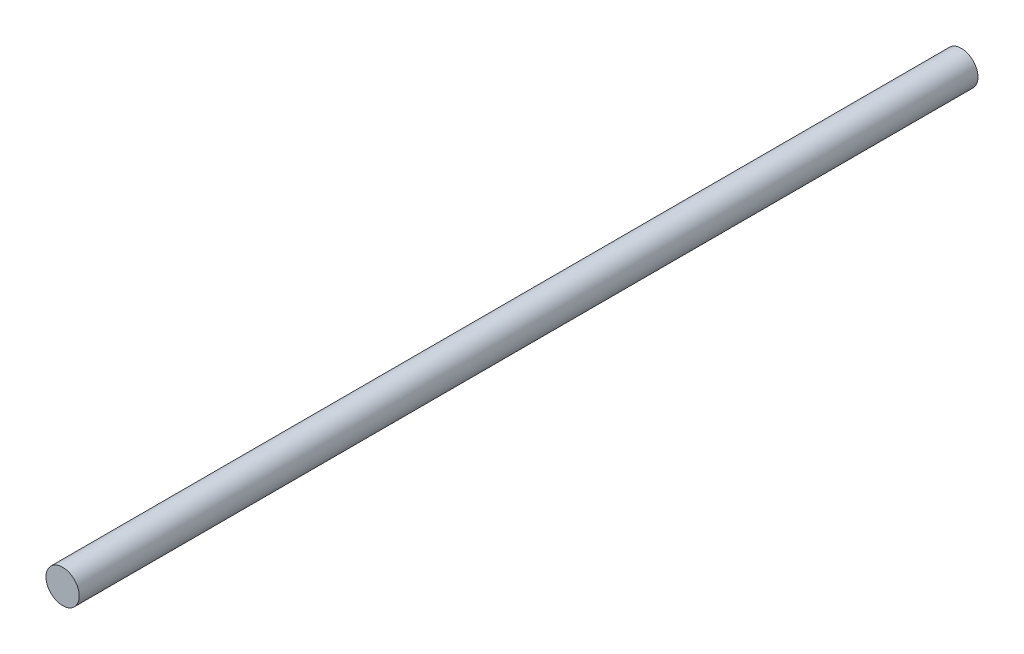
ISO-10303-21;
HEADER;
FILE_DESCRIPTION(('STEP AP214'),'2;1');
FILE_NAME('part.step','',(''),(''),'','','');
FILE_SCHEMA(('AUTOMOTIVE_DESIGN { 1 0 10303 214 1 1 1 1 }'));
ENDSEC;
DATA;
#1=APPLICATION_CONTEXT('core data for automotive mechanical design processes');
#2=APPLICATION_PROTOCOL_DEFINITION('international standard','automotive_design',2000,#1);
#3=PRODUCT_CONTEXT('',#1,'mechanical');
#4=PRODUCT('Part','Part','',(#3));
#5=PRODUCT_RELATED_PRODUCT_CATEGORY('part','',(#4));
#6=PRODUCT_DEFINITION_FORMATION('','',#4);
#7=PRODUCT_DEFINITION_CONTEXT('part definition',#1,'design');
#8=PRODUCT_DEFINITION('design','',#6,#7);
#9=PRODUCT_DEFINITION_SHAPE('','',#8);
#10=(LENGTH_UNIT() NAMED_UNIT(*) SI_UNIT(.MILLI.,.METRE.));
#11=(NAMED_UNIT(*) PLANE_ANGLE_UNIT() SI_UNIT($,.RADIAN.));
#12=(NAMED_UNIT(*) SI_UNIT($,.STERADIAN.) SOLID_ANGLE_UNIT());
#13=UNCERTAINTY_MEASURE_WITH_UNIT(LENGTH_MEASURE(1.E-05),#10,'distance_accuracy_value','');
#14=(GEOMETRIC_REPRESENTATION_CONTEXT(3) GLOBAL_UNCERTAINTY_ASSIGNED_CONTEXT((#13)) GLOBAL_UNIT_ASSIGNED_CONTEXT((#10,
#11,#12)) REPRESENTATION_CONTEXT('',''));
#15=CARTESIAN_POINT('',(0.,0.,0.));
#16=DIRECTION('',(0.,0.,1.));
#17=DIRECTION('',(1.,0.,0.));
#18=AXIS2_PLACEMENT_3D('',#15,#16,#17);
#19=CARTESIAN_POINT('',(0.,0.,135.));
#20=DIRECTION('',(0.,0.,-1.));
#21=DIRECTION('',(-1.,0.,0.));
#22=AXIS2_PLACEMENT_3D('',#19,#20,#21);
#23=CYLINDRICAL_SURFACE('',#22,2.5);
#24=CARTESIAN_POINT('',(0.,0.,135.));
#25=DIRECTION('',(0.,0.,1.));
#26=DIRECTION('',(1.,0.,0.));
#27=AXIS2_PLACEMENT_3D('',#24,#25,#26);
#28=CIRCLE('',#27,2.5);
#29=CARTESIAN_POINT('',(2.5,0.,135.));
#30=VERTEX_POINT('',#29);
#31=EDGE_CURVE('E10',#30,#30,#28,.T.);
#32=ORIENTED_EDGE('',*,*,#31,.F.);
#33=EDGE_LOOP('',(#32));
#34=FACE_BOUND('',#33,.T.);
#35=CARTESIAN_POINT('',(0.,0.,0.));
#36=DIRECTION('',(0.,0.,1.));
#37=DIRECTION('',(1.,0.,0.));
#38=AXIS2_PLACEMENT_3D('',#35,#36,#37);
#39=CIRCLE('',#38,2.5);
#40=CARTESIAN_POINT('',(2.5,0.,0.));
#41=VERTEX_POINT('',#40);
#42=EDGE_CURVE('E34',#41,#41,#39,.T.);
#43=ORIENTED_EDGE('',*,*,#42,.T.);
#44=EDGE_LOOP('',(#43));
#45=FACE_BOUND('',#44,.T.);
#46=ADVANCED_FACE('F31',(#34,#45),#23,.T.);
#47=CARTESIAN_POINT('',(0.,0.,135.));
#48=DIRECTION('',(0.,0.,1.));
#49=DIRECTION('',(1.,0.,0.));
#50=AXIS2_PLACEMENT_3D('',#47,#48,#49);
#51=PLANE('',#50);
#52=ORIENTED_EDGE('',*,*,#31,.T.);
#53=EDGE_LOOP('',(#52));
#54=FACE_BOUND('',#53,.T.);
#55=ADVANCED_FACE('F46',(#54),#51,.T.);
#56=CARTESIAN_POINT('',(0.,0.,0.));
#57=DIRECTION('',(0.,0.,1.));
#58=DIRECTION('',(1.,0.,0.));
#59=AXIS2_PLACEMENT_3D('',#56,#57,#58);
#60=PLANE('',#59);
#61=ORIENTED_EDGE('',*,*,#42,.F.);
#62=EDGE_LOOP('',(#61));
#63=FACE_BOUND('',#62,.T.);
#64=ADVANCED_FACE('F44',(#63),#60,.F.);
#65=CLOSED_SHELL('',(#46,#55,#64));
#66=MANIFOLD_SOLID_BREP('B2',#65);
#67=ADVANCED_BREP_SHAPE_REPRESENTATION('',(#18,#66),#14);
#68=SHAPE_DEFINITION_REPRESENTATION(#9,#67);
ENDSEC;
END-ISO-10303-21;
